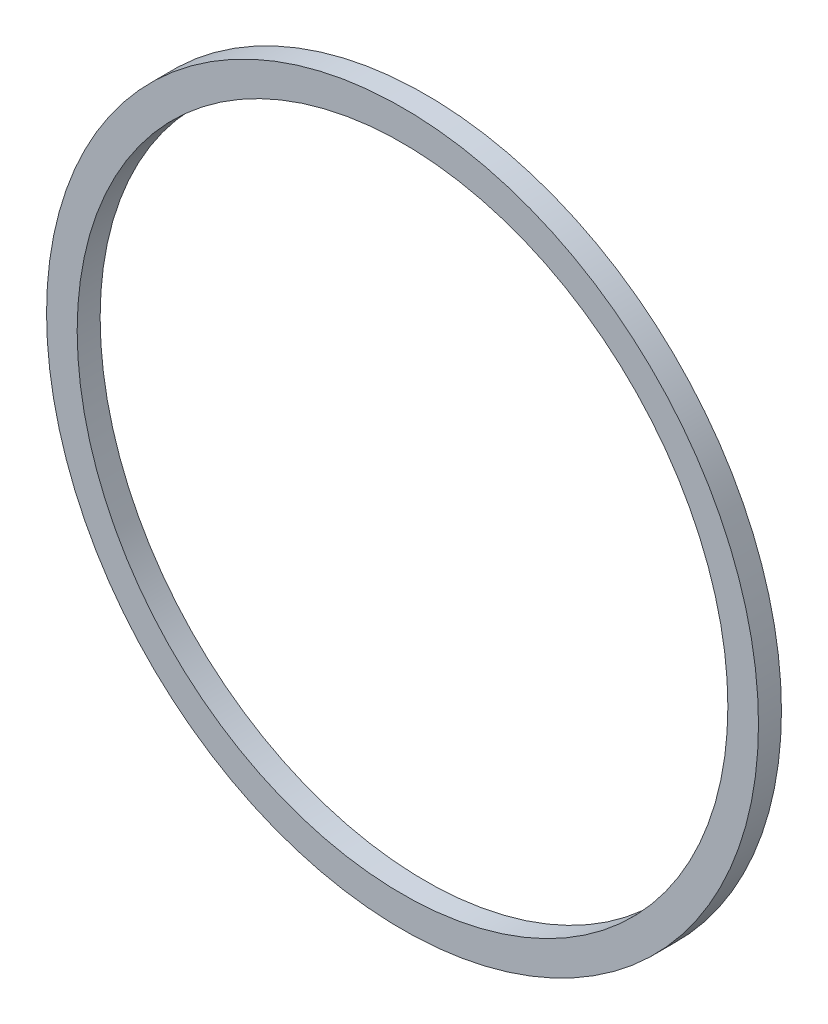
ISO-10303-21;
HEADER;
FILE_DESCRIPTION(('STEP AP214'),'2;1');
FILE_NAME('part.step','',(''),(''),'','','');
FILE_SCHEMA(('AUTOMOTIVE_DESIGN { 1 0 10303 214 1 1 1 1 }'));
ENDSEC;
DATA;
#1=APPLICATION_CONTEXT('core data for automotive mechanical design processes');
#2=APPLICATION_PROTOCOL_DEFINITION('international standard','automotive_design',2000,#1);
#3=PRODUCT_CONTEXT('',#1,'mechanical');
#4=PRODUCT('Part','Part','',(#3));
#5=PRODUCT_RELATED_PRODUCT_CATEGORY('part','',(#4));
#6=PRODUCT_DEFINITION_FORMATION('','',#4);
#7=PRODUCT_DEFINITION_CONTEXT('part definition',#1,'design');
#8=PRODUCT_DEFINITION('design','',#6,#7);
#9=PRODUCT_DEFINITION_SHAPE('','',#8);
#10=(LENGTH_UNIT() NAMED_UNIT(*) SI_UNIT(.MILLI.,.METRE.));
#11=(NAMED_UNIT(*) PLANE_ANGLE_UNIT() SI_UNIT($,.RADIAN.));
#12=(NAMED_UNIT(*) SI_UNIT($,.STERADIAN.) SOLID_ANGLE_UNIT());
#13=UNCERTAINTY_MEASURE_WITH_UNIT(LENGTH_MEASURE(1.E-05),#10,'distance_accuracy_value','');
#14=(GEOMETRIC_REPRESENTATION_CONTEXT(3) GLOBAL_UNCERTAINTY_ASSIGNED_CONTEXT((#13)) GLOBAL_UNIT_ASSIGNED_CONTEXT((#10,
#11,#12)) REPRESENTATION_CONTEXT('',''));
#15=CARTESIAN_POINT('',(0.,0.,0.));
#16=DIRECTION('',(0.,0.,1.));
#17=DIRECTION('',(1.,0.,0.));
#18=AXIS2_PLACEMENT_3D('',#15,#16,#17);
#19=CARTESIAN_POINT('',(0.,0.,1.5));
#20=DIRECTION('',(0.,0.,1.));
#21=DIRECTION('',(1.,0.,0.));
#22=AXIS2_PLACEMENT_3D('',#19,#20,#21);
#23=PLANE('',#22);
#24=CARTESIAN_POINT('',(0.,0.,1.5));
#25=DIRECTION('',(0.,0.,1.));
#26=DIRECTION('',(1.,0.,0.));
#27=AXIS2_PLACEMENT_3D('',#24,#25,#26);
#28=CIRCLE('',#27,46.5);
#29=CARTESIAN_POINT('',(46.5,0.,1.5));
#30=VERTEX_POINT('',#29);
#31=EDGE_CURVE('E10',#30,#30,#28,.T.);
#32=ORIENTED_EDGE('',*,*,#31,.T.);
#33=EDGE_LOOP('',(#32));
#34=FACE_BOUND('',#33,.T.);
#35=CARTESIAN_POINT('',(0.,0.,1.5));
#36=DIRECTION('',(0.,0.,1.));
#37=DIRECTION('',(1.,0.,0.));
#38=AXIS2_PLACEMENT_3D('',#35,#36,#37);
#39=CIRCLE('',#38,42.5);
#40=CARTESIAN_POINT('',(42.5,0.,1.5));
#41=VERTEX_POINT('',#40);
#42=EDGE_CURVE('E54',#41,#41,#39,.T.);
#43=ORIENTED_EDGE('',*,*,#42,.F.);
#44=EDGE_LOOP('',(#43));
#45=FACE_BOUND('',#44,.T.);
#46=ADVANCED_FACE('F41',(#34,#45),#23,.T.);
#47=CARTESIAN_POINT('',(0.,0.,-1.5));
#48=DIRECTION('',(0.,0.,1.));
#49=DIRECTION('',(1.,0.,0.));
#50=AXIS2_PLACEMENT_3D('',#47,#48,#49);
#51=PLANE('',#50);
#52=CARTESIAN_POINT('',(0.,0.,-1.5));
#53=DIRECTION('',(0.,0.,1.));
#54=DIRECTION('',(1.,0.,0.));
#55=AXIS2_PLACEMENT_3D('',#52,#53,#54);
#56=CIRCLE('',#55,46.5);
#57=CARTESIAN_POINT('',(46.5,0.,-1.5));
#58=VERTEX_POINT('',#57);
#59=EDGE_CURVE('E45',#58,#58,#56,.T.);
#60=ORIENTED_EDGE('',*,*,#59,.F.);
#61=EDGE_LOOP('',(#60));
#62=FACE_BOUND('',#61,.T.);
#63=CARTESIAN_POINT('',(0.,0.,-1.5));
#64=DIRECTION('',(0.,0.,1.));
#65=DIRECTION('',(1.,0.,0.));
#66=AXIS2_PLACEMENT_3D('',#63,#64,#65);
#67=CIRCLE('',#66,42.5);
#68=CARTESIAN_POINT('',(42.5,0.,-1.5));
#69=VERTEX_POINT('',#68);
#70=EDGE_CURVE('E56',#69,#69,#67,.T.);
#71=ORIENTED_EDGE('',*,*,#70,.T.);
#72=EDGE_LOOP('',(#71));
#73=FACE_BOUND('',#72,.T.);
#74=ADVANCED_FACE('F68',(#62,#73),#51,.F.);
#75=CARTESIAN_POINT('',(0.,0.,1.5));
#76=DIRECTION('',(0.,0.,-1.));
#77=DIRECTION('',(-1.,0.,0.));
#78=AXIS2_PLACEMENT_3D('',#75,#76,#77);
#79=CYLINDRICAL_SURFACE('',#78,46.5);
#80=ORIENTED_EDGE('',*,*,#31,.F.);
#81=EDGE_LOOP('',(#80));
#82=FACE_BOUND('',#81,.T.);
#83=ORIENTED_EDGE('',*,*,#59,.T.);
#84=EDGE_LOOP('',(#83));
#85=FACE_BOUND('',#84,.T.);
#86=ADVANCED_FACE('F43',(#82,#85),#79,.T.);
#87=CARTESIAN_POINT('',(0.,0.,1.5));
#88=DIRECTION('',(0.,0.,-1.));
#89=DIRECTION('',(-1.,0.,0.));
#90=AXIS2_PLACEMENT_3D('',#87,#88,#89);
#91=CYLINDRICAL_SURFACE('',#90,42.5);
#92=ORIENTED_EDGE('',*,*,#42,.T.);
#93=EDGE_LOOP('',(#92));
#94=FACE_BOUND('',#93,.T.);
#95=ORIENTED_EDGE('',*,*,#70,.F.);
#96=EDGE_LOOP('',(#95));
#97=FACE_BOUND('',#96,.T.);
#98=ADVANCED_FACE('F64',(#94,#97),#91,.F.);
#99=CLOSED_SHELL('',(#46,#74,#86,#98));
#100=MANIFOLD_SOLID_BREP('B2',#99);
#101=ADVANCED_BREP_SHAPE_REPRESENTATION('',(#18,#100),#14);
#102=SHAPE_DEFINITION_REPRESENTATION(#9,#101);
ENDSEC;
END-ISO-10303-21;
